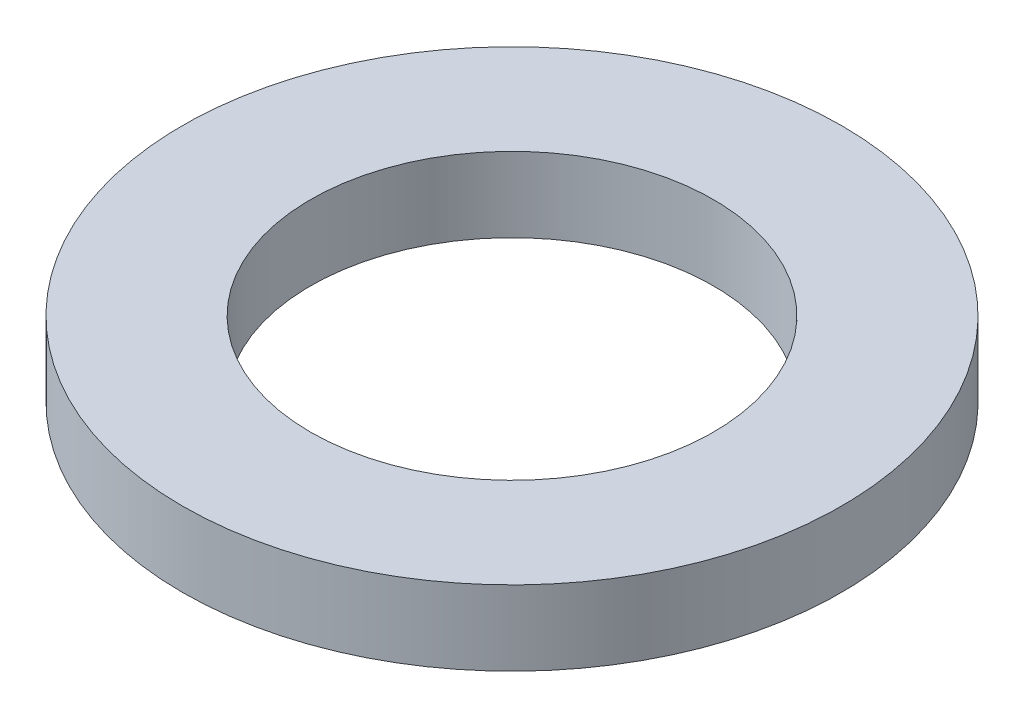
ISO-10303-21;
HEADER;
FILE_DESCRIPTION(('STEP AP214'),'2;1');
FILE_NAME('part.step','',(''),(''),'','','');
FILE_SCHEMA(('AUTOMOTIVE_DESIGN { 1 0 10303 214 1 1 1 1 }'));
ENDSEC;
DATA;
#1=APPLICATION_CONTEXT('core data for automotive mechanical design processes');
#2=APPLICATION_PROTOCOL_DEFINITION('international standard','automotive_design',2000,#1);
#3=PRODUCT_CONTEXT('',#1,'mechanical');
#4=PRODUCT('Part','Part','',(#3));
#5=PRODUCT_RELATED_PRODUCT_CATEGORY('part','',(#4));
#6=PRODUCT_DEFINITION_FORMATION('','',#4);
#7=PRODUCT_DEFINITION_CONTEXT('part definition',#1,'design');
#8=PRODUCT_DEFINITION('design','',#6,#7);
#9=PRODUCT_DEFINITION_SHAPE('','',#8);
#10=(LENGTH_UNIT() NAMED_UNIT(*) SI_UNIT(.MILLI.,.METRE.));
#11=(NAMED_UNIT(*) PLANE_ANGLE_UNIT() SI_UNIT($,.RADIAN.));
#12=(NAMED_UNIT(*) SI_UNIT($,.STERADIAN.) SOLID_ANGLE_UNIT());
#13=UNCERTAINTY_MEASURE_WITH_UNIT(LENGTH_MEASURE(1.E-05),#10,'distance_accuracy_value','');
#14=(GEOMETRIC_REPRESENTATION_CONTEXT(3) GLOBAL_UNCERTAINTY_ASSIGNED_CONTEXT((#13)) GLOBAL_UNIT_ASSIGNED_CONTEXT((#10,
#11,#12)) REPRESENTATION_CONTEXT('',''));
#15=CARTESIAN_POINT('',(0.,0.,0.));
#16=DIRECTION('',(0.,0.,1.));
#17=DIRECTION('',(1.,0.,0.));
#18=AXIS2_PLACEMENT_3D('',#15,#16,#17);
#19=CARTESIAN_POINT('',(0.,3.559175,0.));
#20=DIRECTION('',(0.,1.,0.));
#21=DIRECTION('',(0.,0.,1.));
#22=AXIS2_PLACEMENT_3D('',#19,#20,#21);
#23=PLANE('',#22);
#24=CARTESIAN_POINT('',(0.,3.559175,0.));
#25=DIRECTION('',(0.,1.,0.));
#26=DIRECTION('',(0.,0.,1.));
#27=AXIS2_PLACEMENT_3D('',#24,#25,#26);
#28=CIRCLE('',#27,15.6845);
#29=CARTESIAN_POINT('',(0.,3.559175,15.6845));
#30=VERTEX_POINT('',#29);
#31=EDGE_CURVE('E10',#30,#30,#28,.T.);
#32=ORIENTED_EDGE('',*,*,#31,.T.);
#33=EDGE_LOOP('',(#32));
#34=FACE_BOUND('',#33,.T.);
#35=CARTESIAN_POINT('',(0.,3.559175,0.));
#36=DIRECTION('',(0.,1.,0.));
#37=DIRECTION('',(0.,0.,1.));
#38=AXIS2_PLACEMENT_3D('',#35,#36,#37);
#39=CIRCLE('',#38,9.5885);
#40=CARTESIAN_POINT('',(0.,3.559175,9.5885));
#41=VERTEX_POINT('',#40);
#42=EDGE_CURVE('E58',#41,#41,#39,.T.);
#43=ORIENTED_EDGE('',*,*,#42,.F.);
#44=EDGE_LOOP('',(#43));
#45=FACE_BOUND('',#44,.T.);
#46=ADVANCED_FACE('F45',(#34,#45),#23,.T.);
#47=CARTESIAN_POINT('',(0.,0.,0.));
#48=DIRECTION('',(0.,1.,0.));
#49=DIRECTION('',(0.,0.,1.));
#50=AXIS2_PLACEMENT_3D('',#47,#48,#49);
#51=PLANE('',#50);
#52=CARTESIAN_POINT('',(0.,0.,0.));
#53=DIRECTION('',(0.,1.,0.));
#54=DIRECTION('',(0.,0.,1.));
#55=AXIS2_PLACEMENT_3D('',#52,#53,#54);
#56=CIRCLE('',#55,15.6845);
#57=CARTESIAN_POINT('',(0.,0.,15.6845));
#58=VERTEX_POINT('',#57);
#59=EDGE_CURVE('E49',#58,#58,#56,.T.);
#60=ORIENTED_EDGE('',*,*,#59,.F.);
#61=EDGE_LOOP('',(#60));
#62=FACE_BOUND('',#61,.T.);
#63=CARTESIAN_POINT('',(0.,0.,0.));
#64=DIRECTION('',(0.,1.,0.));
#65=DIRECTION('',(0.,0.,1.));
#66=AXIS2_PLACEMENT_3D('',#63,#64,#65);
#67=CIRCLE('',#66,9.5885);
#68=CARTESIAN_POINT('',(0.,0.,9.5885));
#69=VERTEX_POINT('',#68);
#70=EDGE_CURVE('E60',#69,#69,#67,.T.);
#71=ORIENTED_EDGE('',*,*,#70,.T.);
#72=EDGE_LOOP('',(#71));
#73=FACE_BOUND('',#72,.T.);
#74=ADVANCED_FACE('F72',(#62,#73),#51,.F.);
#75=CARTESIAN_POINT('',(0.,3.559175,0.));
#76=DIRECTION('',(0.,-1.,0.));
#77=DIRECTION('',(0.,0.,-1.));
#78=AXIS2_PLACEMENT_3D('',#75,#76,#77);
#79=CYLINDRICAL_SURFACE('',#78,15.6845);
#80=ORIENTED_EDGE('',*,*,#31,.F.);
#81=EDGE_LOOP('',(#80));
#82=FACE_BOUND('',#81,.T.);
#83=ORIENTED_EDGE('',*,*,#59,.T.);
#84=EDGE_LOOP('',(#83));
#85=FACE_BOUND('',#84,.T.);
#86=ADVANCED_FACE('F47',(#82,#85),#79,.T.);
#87=CARTESIAN_POINT('',(0.,3.559175,0.));
#88=DIRECTION('',(0.,-1.,0.));
#89=DIRECTION('',(0.,0.,-1.));
#90=AXIS2_PLACEMENT_3D('',#87,#88,#89);
#91=CYLINDRICAL_SURFACE('',#90,9.5885);
#92=ORIENTED_EDGE('',*,*,#42,.T.);
#93=EDGE_LOOP('',(#92));
#94=FACE_BOUND('',#93,.T.);
#95=ORIENTED_EDGE('',*,*,#70,.F.);
#96=EDGE_LOOP('',(#95));
#97=FACE_BOUND('',#96,.T.);
#98=ADVANCED_FACE('F68',(#94,#97),#91,.F.);
#99=CLOSED_SHELL('',(#46,#74,#86,#98));
#100=MANIFOLD_SOLID_BREP('B2',#99);
#101=ADVANCED_BREP_SHAPE_REPRESENTATION('',(#18,#100),#14);
#102=SHAPE_DEFINITION_REPRESENTATION(#9,#101);
ENDSEC;
END-ISO-10303-21;
